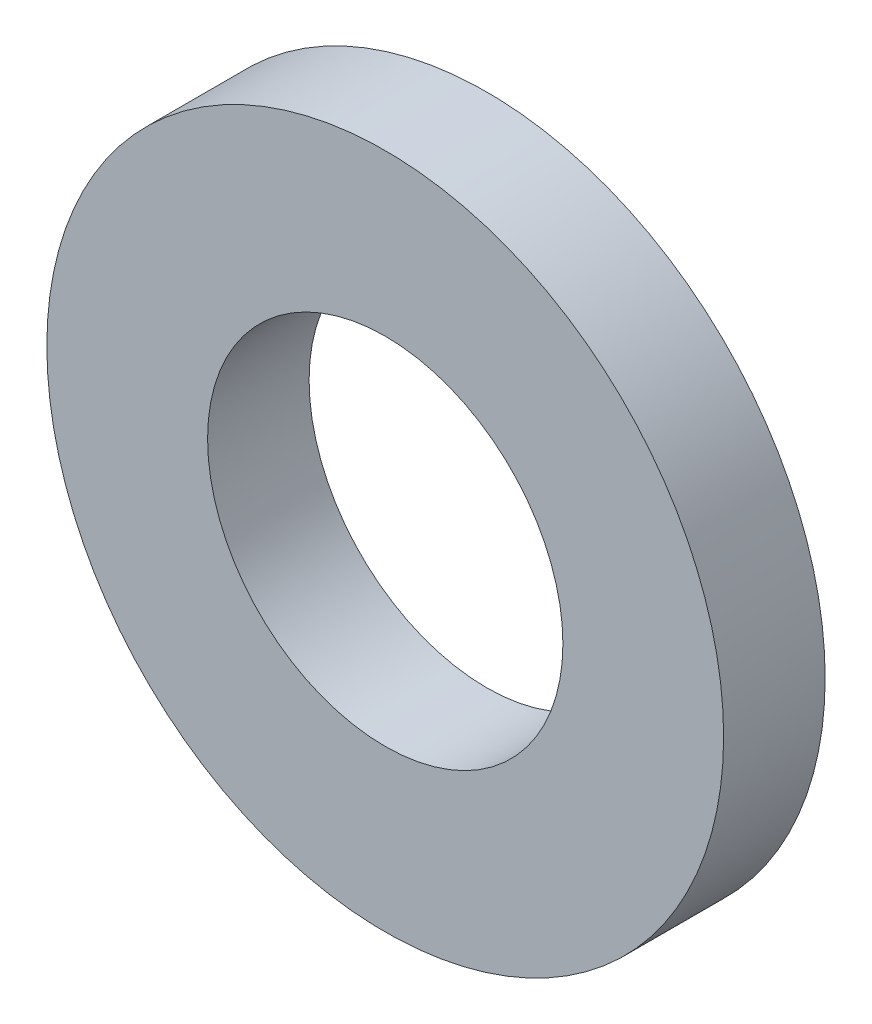
ISO-10303-21;
HEADER;
FILE_DESCRIPTION(('STEP AP214'),'2;1');
FILE_NAME('part.step','',(''),(''),'','','');
FILE_SCHEMA(('AUTOMOTIVE_DESIGN { 1 0 10303 214 1 1 1 1 }'));
ENDSEC;
DATA;
#1=APPLICATION_CONTEXT('core data for automotive mechanical design processes');
#2=APPLICATION_PROTOCOL_DEFINITION('international standard','automotive_design',2000,#1);
#3=PRODUCT_CONTEXT('',#1,'mechanical');
#4=PRODUCT('Part','Part','',(#3));
#5=PRODUCT_RELATED_PRODUCT_CATEGORY('part','',(#4));
#6=PRODUCT_DEFINITION_FORMATION('','',#4);
#7=PRODUCT_DEFINITION_CONTEXT('part definition',#1,'design');
#8=PRODUCT_DEFINITION('design','',#6,#7);
#9=PRODUCT_DEFINITION_SHAPE('','',#8);
#10=(LENGTH_UNIT() NAMED_UNIT(*) SI_UNIT(.MILLI.,.METRE.));
#11=(NAMED_UNIT(*) PLANE_ANGLE_UNIT() SI_UNIT($,.RADIAN.));
#12=(NAMED_UNIT(*) SI_UNIT($,.STERADIAN.) SOLID_ANGLE_UNIT());
#13=UNCERTAINTY_MEASURE_WITH_UNIT(LENGTH_MEASURE(1.E-05),#10,'distance_accuracy_value','');
#14=(GEOMETRIC_REPRESENTATION_CONTEXT(3) GLOBAL_UNCERTAINTY_ASSIGNED_CONTEXT((#13)) GLOBAL_UNIT_ASSIGNED_CONTEXT((#10,
#11,#12)) REPRESENTATION_CONTEXT('',''));
#15=CARTESIAN_POINT('',(0.,0.,0.));
#16=DIRECTION('',(0.,0.,1.));
#17=DIRECTION('',(1.,0.,0.));
#18=AXIS2_PLACEMENT_3D('',#15,#16,#17);
#19=CARTESIAN_POINT('',(0.,0.,0.6));
#20=DIRECTION('',(0.,0.,1.));
#21=DIRECTION('',(1.,0.,0.));
#22=AXIS2_PLACEMENT_3D('',#19,#20,#21);
#23=PLANE('',#22);
#24=CARTESIAN_POINT('',(0.,0.,0.6));
#25=DIRECTION('',(0.,0.,1.));
#26=DIRECTION('',(1.,0.,0.));
#27=AXIS2_PLACEMENT_3D('',#24,#25,#26);
#28=CIRCLE('',#27,2.);
#29=CARTESIAN_POINT('',(2.,0.,0.6));
#30=VERTEX_POINT('',#29);
#31=EDGE_CURVE('E10',#30,#30,#28,.T.);
#32=ORIENTED_EDGE('',*,*,#31,.T.);
#33=EDGE_LOOP('',(#32));
#34=FACE_BOUND('',#33,.T.);
#35=CARTESIAN_POINT('',(0.,0.,0.6));
#36=DIRECTION('',(0.,0.,1.));
#37=DIRECTION('',(1.,0.,0.));
#38=AXIS2_PLACEMENT_3D('',#35,#36,#37);
#39=CIRCLE('',#38,1.05);
#40=CARTESIAN_POINT('',(1.05,0.,0.6));
#41=VERTEX_POINT('',#40);
#42=EDGE_CURVE('E43',#41,#41,#39,.T.);
#43=ORIENTED_EDGE('',*,*,#42,.F.);
#44=EDGE_LOOP('',(#43));
#45=FACE_BOUND('',#44,.T.);
#46=ADVANCED_FACE('F32',(#34,#45),#23,.T.);
#47=CARTESIAN_POINT('',(0.,0.,0.));
#48=DIRECTION('',(0.,0.,1.));
#49=DIRECTION('',(1.,0.,0.));
#50=AXIS2_PLACEMENT_3D('',#47,#48,#49);
#51=PLANE('',#50);
#52=CARTESIAN_POINT('',(0.,0.,0.));
#53=DIRECTION('',(0.,0.,1.));
#54=DIRECTION('',(1.,0.,0.));
#55=AXIS2_PLACEMENT_3D('',#52,#53,#54);
#56=CIRCLE('',#55,2.);
#57=CARTESIAN_POINT('',(2.,0.,0.));
#58=VERTEX_POINT('',#57);
#59=EDGE_CURVE('E36',#58,#58,#56,.T.);
#60=ORIENTED_EDGE('',*,*,#59,.F.);
#61=EDGE_LOOP('',(#60));
#62=FACE_BOUND('',#61,.T.);
#63=CARTESIAN_POINT('',(0.,0.,0.));
#64=DIRECTION('',(0.,0.,1.));
#65=DIRECTION('',(1.,0.,0.));
#66=AXIS2_PLACEMENT_3D('',#63,#64,#65);
#67=CIRCLE('',#66,1.05);
#68=CARTESIAN_POINT('',(1.05,0.,0.));
#69=VERTEX_POINT('',#68);
#70=EDGE_CURVE('E45',#69,#69,#67,.T.);
#71=ORIENTED_EDGE('',*,*,#70,.T.);
#72=EDGE_LOOP('',(#71));
#73=FACE_BOUND('',#72,.T.);
#74=ADVANCED_FACE('F55',(#62,#73),#51,.F.);
#75=CARTESIAN_POINT('',(0.,0.,0.6));
#76=DIRECTION('',(0.,0.,-1.));
#77=DIRECTION('',(-1.,0.,0.));
#78=AXIS2_PLACEMENT_3D('',#75,#76,#77);
#79=CYLINDRICAL_SURFACE('',#78,2.);
#80=ORIENTED_EDGE('',*,*,#31,.F.);
#81=EDGE_LOOP('',(#80));
#82=FACE_BOUND('',#81,.T.);
#83=ORIENTED_EDGE('',*,*,#59,.T.);
#84=EDGE_LOOP('',(#83));
#85=FACE_BOUND('',#84,.T.);
#86=ADVANCED_FACE('F34',(#82,#85),#79,.T.);
#87=CARTESIAN_POINT('',(0.,0.,0.6));
#88=DIRECTION('',(0.,0.,-1.));
#89=DIRECTION('',(-1.,0.,0.));
#90=AXIS2_PLACEMENT_3D('',#87,#88,#89);
#91=CYLINDRICAL_SURFACE('',#90,1.05);
#92=ORIENTED_EDGE('',*,*,#42,.T.);
#93=EDGE_LOOP('',(#92));
#94=FACE_BOUND('',#93,.T.);
#95=ORIENTED_EDGE('',*,*,#70,.F.);
#96=EDGE_LOOP('',(#95));
#97=FACE_BOUND('',#96,.T.);
#98=ADVANCED_FACE('F51',(#94,#97),#91,.F.);
#99=CLOSED_SHELL('',(#46,#74,#86,#98));
#100=MANIFOLD_SOLID_BREP('B2',#99);
#101=ADVANCED_BREP_SHAPE_REPRESENTATION('',(#18,#100),#14);
#102=SHAPE_DEFINITION_REPRESENTATION(#9,#101);
ENDSEC;
END-ISO-10303-21;
